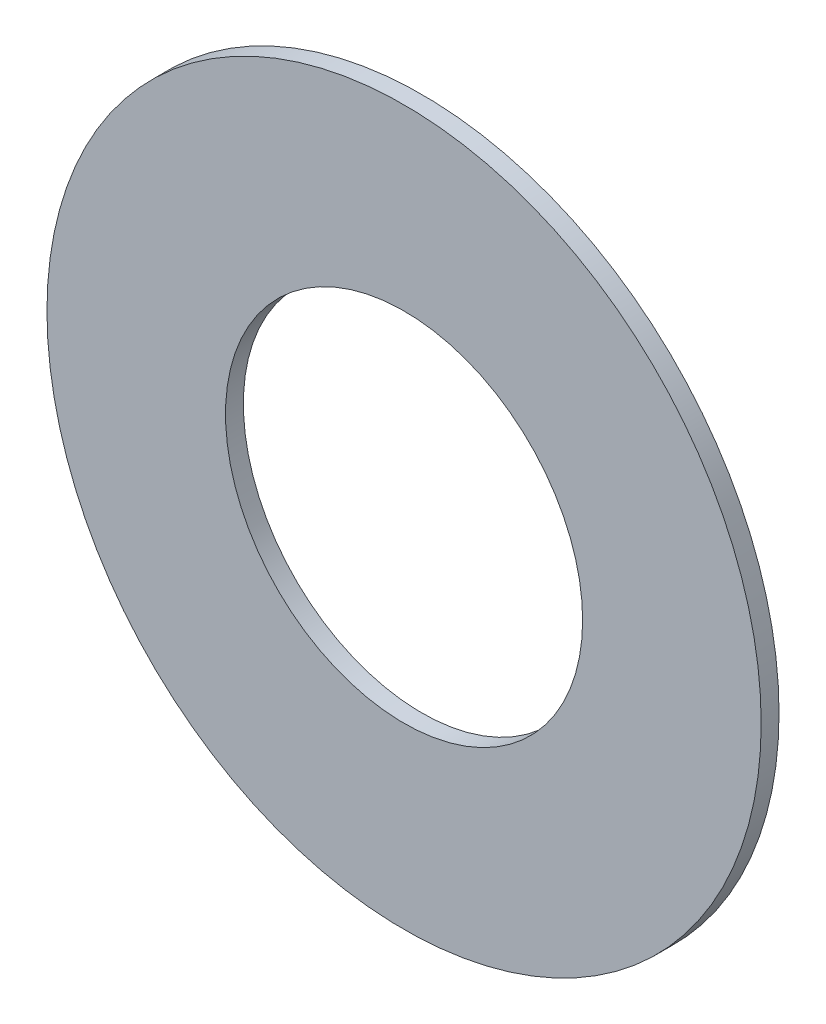
ISO-10303-21;
HEADER;
FILE_DESCRIPTION(('STEP AP214'),'2;1');
FILE_NAME('part.step','',(''),(''),'','','');
FILE_SCHEMA(('AUTOMOTIVE_DESIGN { 1 0 10303 214 1 1 1 1 }'));
ENDSEC;
DATA;
#1=APPLICATION_CONTEXT('core data for automotive mechanical design processes');
#2=APPLICATION_PROTOCOL_DEFINITION('international standard','automotive_design',2000,#1);
#3=PRODUCT_CONTEXT('',#1,'mechanical');
#4=PRODUCT('Part','Part','',(#3));
#5=PRODUCT_RELATED_PRODUCT_CATEGORY('part','',(#4));
#6=PRODUCT_DEFINITION_FORMATION('','',#4);
#7=PRODUCT_DEFINITION_CONTEXT('part definition',#1,'design');
#8=PRODUCT_DEFINITION('design','',#6,#7);
#9=PRODUCT_DEFINITION_SHAPE('','',#8);
#10=(LENGTH_UNIT() NAMED_UNIT(*) SI_UNIT(.MILLI.,.METRE.));
#11=(NAMED_UNIT(*) PLANE_ANGLE_UNIT() SI_UNIT($,.RADIAN.));
#12=(NAMED_UNIT(*) SI_UNIT($,.STERADIAN.) SOLID_ANGLE_UNIT());
#13=UNCERTAINTY_MEASURE_WITH_UNIT(LENGTH_MEASURE(1.E-05),#10,'distance_accuracy_value','');
#14=(GEOMETRIC_REPRESENTATION_CONTEXT(3) GLOBAL_UNCERTAINTY_ASSIGNED_CONTEXT((#13)) GLOBAL_UNIT_ASSIGNED_CONTEXT((#10,
#11,#12)) REPRESENTATION_CONTEXT('',''));
#15=CARTESIAN_POINT('',(0.,0.,0.));
#16=DIRECTION('',(0.,0.,1.));
#17=DIRECTION('',(1.,0.,0.));
#18=AXIS2_PLACEMENT_3D('',#15,#16,#17);
#19=CARTESIAN_POINT('',(0.,0.,0.5));
#20=DIRECTION('',(0.,0.,1.));
#21=DIRECTION('',(1.,0.,0.));
#22=AXIS2_PLACEMENT_3D('',#19,#20,#21);
#23=PLANE('',#22);
#24=CARTESIAN_POINT('',(0.,0.,0.5));
#25=DIRECTION('',(0.,0.,1.));
#26=DIRECTION('',(1.,0.,0.));
#27=AXIS2_PLACEMENT_3D('',#24,#25,#26);
#28=CIRCLE('',#27,10.);
#29=CARTESIAN_POINT('',(10.,0.,0.5));
#30=VERTEX_POINT('',#29);
#31=EDGE_CURVE('E10',#30,#30,#28,.T.);
#32=ORIENTED_EDGE('',*,*,#31,.T.);
#33=EDGE_LOOP('',(#32));
#34=FACE_BOUND('',#33,.T.);
#35=CARTESIAN_POINT('',(0.,0.,0.5));
#36=DIRECTION('',(0.,0.,1.));
#37=DIRECTION('',(1.,0.,0.));
#38=AXIS2_PLACEMENT_3D('',#35,#36,#37);
#39=CIRCLE('',#38,5.);
#40=CARTESIAN_POINT('',(5.,0.,0.5));
#41=VERTEX_POINT('',#40);
#42=EDGE_CURVE('E55',#41,#41,#39,.T.);
#43=ORIENTED_EDGE('',*,*,#42,.F.);
#44=EDGE_LOOP('',(#43));
#45=FACE_BOUND('',#44,.T.);
#46=ADVANCED_FACE('F41',(#34,#45),#23,.T.);
#47=CARTESIAN_POINT('',(0.,0.,0.));
#48=DIRECTION('',(0.,0.,1.));
#49=DIRECTION('',(1.,0.,0.));
#50=AXIS2_PLACEMENT_3D('',#47,#48,#49);
#51=PLANE('',#50);
#52=CARTESIAN_POINT('',(0.,0.,0.));
#53=DIRECTION('',(0.,0.,1.));
#54=DIRECTION('',(1.,0.,0.));
#55=AXIS2_PLACEMENT_3D('',#52,#53,#54);
#56=CIRCLE('',#55,10.);
#57=CARTESIAN_POINT('',(10.,0.,0.));
#58=VERTEX_POINT('',#57);
#59=EDGE_CURVE('E45',#58,#58,#56,.T.);
#60=ORIENTED_EDGE('',*,*,#59,.F.);
#61=EDGE_LOOP('',(#60));
#62=FACE_BOUND('',#61,.T.);
#63=CARTESIAN_POINT('',(0.,0.,0.));
#64=DIRECTION('',(0.,0.,1.));
#65=DIRECTION('',(1.,0.,0.));
#66=AXIS2_PLACEMENT_3D('',#63,#64,#65);
#67=CIRCLE('',#66,5.);
#68=CARTESIAN_POINT('',(5.,0.,0.));
#69=VERTEX_POINT('',#68);
#70=EDGE_CURVE('E57',#69,#69,#67,.T.);
#71=ORIENTED_EDGE('',*,*,#70,.T.);
#72=EDGE_LOOP('',(#71));
#73=FACE_BOUND('',#72,.T.);
#74=ADVANCED_FACE('F70',(#62,#73),#51,.F.);
#75=CARTESIAN_POINT('',(0.,0.,0.5));
#76=DIRECTION('',(0.,0.,-1.));
#77=DIRECTION('',(-1.,0.,0.));
#78=AXIS2_PLACEMENT_3D('',#75,#76,#77);
#79=CYLINDRICAL_SURFACE('',#78,10.);
#80=ORIENTED_EDGE('',*,*,#31,.F.);
#81=EDGE_LOOP('',(#80));
#82=FACE_BOUND('',#81,.T.);
#83=ORIENTED_EDGE('',*,*,#59,.T.);
#84=EDGE_LOOP('',(#83));
#85=FACE_BOUND('',#84,.T.);
#86=ADVANCED_FACE('F43',(#82,#85),#79,.T.);
#87=CARTESIAN_POINT('',(0.,0.,0.5));
#88=DIRECTION('',(0.,0.,-1.));
#89=DIRECTION('',(-1.,0.,0.));
#90=AXIS2_PLACEMENT_3D('',#87,#88,#89);
#91=CYLINDRICAL_SURFACE('',#90,5.);
#92=ORIENTED_EDGE('',*,*,#42,.T.);
#93=EDGE_LOOP('',(#92));
#94=FACE_BOUND('',#93,.T.);
#95=ORIENTED_EDGE('',*,*,#70,.F.);
#96=EDGE_LOOP('',(#95));
#97=FACE_BOUND('',#96,.T.);
#98=ADVANCED_FACE('F66',(#94,#97),#91,.F.);
#99=CLOSED_SHELL('',(#46,#74,#86,#98));
#100=MANIFOLD_SOLID_BREP('B2',#99);
#101=ADVANCED_BREP_SHAPE_REPRESENTATION('',(#18,#100),#14);
#102=SHAPE_DEFINITION_REPRESENTATION(#9,#101);
ENDSEC;
END-ISO-10303-21;
